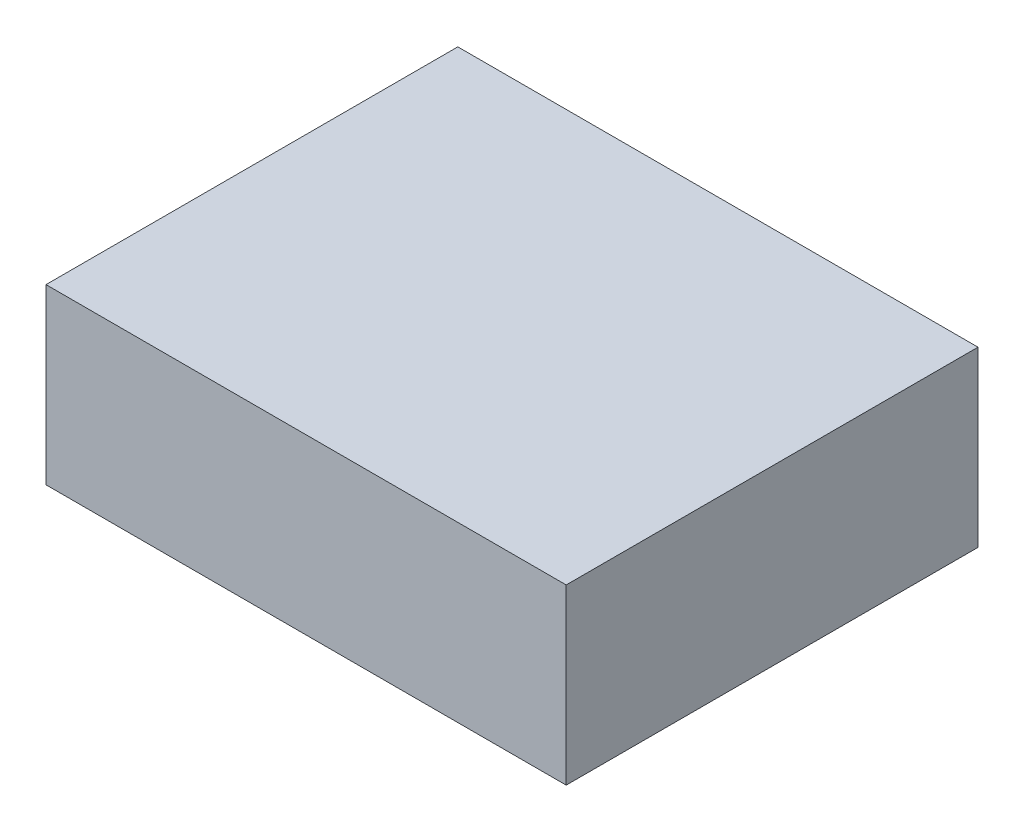
ISO-10303-21;
HEADER;
FILE_DESCRIPTION(('STEP AP214'),'2;1');
FILE_NAME('part.step','',(''),(''),'','','');
FILE_SCHEMA(('AUTOMOTIVE_DESIGN { 1 0 10303 214 1 1 1 1 }'));
ENDSEC;
DATA;
#1=APPLICATION_CONTEXT('core data for automotive mechanical design processes');
#2=APPLICATION_PROTOCOL_DEFINITION('international standard','automotive_design',2000,#1);
#3=PRODUCT_CONTEXT('',#1,'mechanical');
#4=PRODUCT('Part','Part','',(#3));
#5=PRODUCT_RELATED_PRODUCT_CATEGORY('part','',(#4));
#6=PRODUCT_DEFINITION_FORMATION('','',#4);
#7=PRODUCT_DEFINITION_CONTEXT('part definition',#1,'design');
#8=PRODUCT_DEFINITION('design','',#6,#7);
#9=PRODUCT_DEFINITION_SHAPE('','',#8);
#10=(LENGTH_UNIT() NAMED_UNIT(*) SI_UNIT(.MILLI.,.METRE.));
#11=(NAMED_UNIT(*) PLANE_ANGLE_UNIT() SI_UNIT($,.RADIAN.));
#12=(NAMED_UNIT(*) SI_UNIT($,.STERADIAN.) SOLID_ANGLE_UNIT());
#13=UNCERTAINTY_MEASURE_WITH_UNIT(LENGTH_MEASURE(1.E-05),#10,'distance_accuracy_value','');
#14=(GEOMETRIC_REPRESENTATION_CONTEXT(3) GLOBAL_UNCERTAINTY_ASSIGNED_CONTEXT((#13)) GLOBAL_UNIT_ASSIGNED_CONTEXT((#10,
#11,#12)) REPRESENTATION_CONTEXT('',''));
#15=CARTESIAN_POINT('',(0.,0.,0.));
#16=DIRECTION('',(0.,0.,1.));
#17=DIRECTION('',(1.,0.,0.));
#18=AXIS2_PLACEMENT_3D('',#15,#16,#17);
#19=CARTESIAN_POINT('',(-60.,40.,-47.5));
#20=DIRECTION('',(1.,0.,0.));
#21=DIRECTION('',(0.,0.,-1.));
#22=AXIS2_PLACEMENT_3D('',#19,#20,#21);
#23=PLANE('',#22);
#24=DIRECTION('',(0.,0.,1.));
#25=VECTOR('',#24,1.);
#26=CARTESIAN_POINT('',(-60.,0.,-47.5));
#27=LINE('',#26,#25);
#28=CARTESIAN_POINT('',(-60.,0.,-47.5));
#29=VERTEX_POINT('',#28);
#30=CARTESIAN_POINT('',(-60.,0.,47.5));
#31=VERTEX_POINT('',#30);
#32=EDGE_CURVE('E105',#29,#31,#27,.T.);
#33=ORIENTED_EDGE('',*,*,#32,.T.);
#34=DIRECTION('',(0.,-1.,0.));
#35=VECTOR('',#34,1.);
#36=CARTESIAN_POINT('',(-60.,40.,47.5));
#37=LINE('',#36,#35);
#38=CARTESIAN_POINT('',(-60.,40.,47.5));
#39=VERTEX_POINT('',#38);
#40=EDGE_CURVE('E11',#39,#31,#37,.T.);
#41=ORIENTED_EDGE('',*,*,#40,.F.);
#42=DIRECTION('',(0.,0.,1.));
#43=VECTOR('',#42,1.);
#44=CARTESIAN_POINT('',(-60.,40.,-47.5));
#45=LINE('',#44,#43);
#46=CARTESIAN_POINT('',(-60.,40.,-47.5));
#47=VERTEX_POINT('',#46);
#48=EDGE_CURVE('E89',#47,#39,#45,.T.);
#49=ORIENTED_EDGE('',*,*,#48,.F.);
#50=DIRECTION('',(0.,-1.,0.));
#51=VECTOR('',#50,1.);
#52=CARTESIAN_POINT('',(-60.,40.,-47.5));
#53=LINE('',#52,#51);
#54=EDGE_CURVE('E98',#47,#29,#53,.T.);
#55=ORIENTED_EDGE('',*,*,#54,.T.);
#56=EDGE_LOOP('',(#33,#41,#49,#55));
#57=FACE_BOUND('',#56,.T.);
#58=ADVANCED_FACE('F39',(#57),#23,.F.);
#59=CARTESIAN_POINT('',(-60.,40.,47.5));
#60=DIRECTION('',(0.,0.,-1.));
#61=DIRECTION('',(-1.,0.,0.));
#62=AXIS2_PLACEMENT_3D('',#59,#60,#61);
#63=PLANE('',#62);
#64=DIRECTION('',(1.,0.,0.));
#65=VECTOR('',#64,1.);
#66=CARTESIAN_POINT('',(-60.,0.,47.5));
#67=LINE('',#66,#65);
#68=CARTESIAN_POINT('',(60.,0.,47.5));
#69=VERTEX_POINT('',#68);
#70=EDGE_CURVE('E94',#31,#69,#67,.T.);
#71=ORIENTED_EDGE('',*,*,#70,.T.);
#72=DIRECTION('',(0.,-1.,0.));
#73=VECTOR('',#72,1.);
#74=CARTESIAN_POINT('',(60.,40.,47.5));
#75=LINE('',#74,#73);
#76=CARTESIAN_POINT('',(60.,40.,47.5));
#77=VERTEX_POINT('',#76);
#78=EDGE_CURVE('E50',#77,#69,#75,.T.);
#79=ORIENTED_EDGE('',*,*,#78,.F.);
#80=DIRECTION('',(1.,0.,0.));
#81=VECTOR('',#80,1.);
#82=CARTESIAN_POINT('',(-60.,40.,47.5));
#83=LINE('',#82,#81);
#84=EDGE_CURVE('E83',#39,#77,#83,.T.);
#85=ORIENTED_EDGE('',*,*,#84,.F.);
#86=ORIENTED_EDGE('',*,*,#40,.T.);
#87=EDGE_LOOP('',(#71,#79,#85,#86));
#88=FACE_BOUND('',#87,.T.);
#89=ADVANCED_FACE('F91',(#88),#63,.F.);
#90=CARTESIAN_POINT('',(60.,40.,-47.5));
#91=DIRECTION('',(-1.,0.,0.));
#92=DIRECTION('',(0.,0.,1.));
#93=AXIS2_PLACEMENT_3D('',#90,#91,#92);
#94=PLANE('',#93);
#95=DIRECTION('',(0.,0.,-1.));
#96=VECTOR('',#95,1.);
#97=CARTESIAN_POINT('',(60.,0.,-47.5));
#98=LINE('',#97,#96);
#99=CARTESIAN_POINT('',(60.,0.,-47.5));
#100=VERTEX_POINT('',#99);
#101=EDGE_CURVE('E75',#69,#100,#98,.T.);
#102=ORIENTED_EDGE('',*,*,#101,.T.);
#103=DIRECTION('',(0.,-1.,0.));
#104=VECTOR('',#103,1.);
#105=CARTESIAN_POINT('',(60.,40.,-47.5));
#106=LINE('',#105,#104);
#107=CARTESIAN_POINT('',(60.,40.,-47.5));
#108=VERTEX_POINT('',#107);
#109=EDGE_CURVE('E92',#108,#100,#106,.T.);
#110=ORIENTED_EDGE('',*,*,#109,.F.);
#111=DIRECTION('',(0.,0.,-1.));
#112=VECTOR('',#111,1.);
#113=CARTESIAN_POINT('',(60.,40.,-47.5));
#114=LINE('',#113,#112);
#115=EDGE_CURVE('E86',#77,#108,#114,.T.);
#116=ORIENTED_EDGE('',*,*,#115,.F.);
#117=ORIENTED_EDGE('',*,*,#78,.T.);
#118=EDGE_LOOP('',(#102,#110,#116,#117));
#119=FACE_BOUND('',#118,.T.);
#120=ADVANCED_FACE('F96',(#119),#94,.F.);
#121=CARTESIAN_POINT('',(-60.,40.,-47.5));
#122=DIRECTION('',(0.,0.,1.));
#123=DIRECTION('',(1.,0.,0.));
#124=AXIS2_PLACEMENT_3D('',#121,#122,#123);
#125=PLANE('',#124);
#126=DIRECTION('',(-1.,0.,0.));
#127=VECTOR('',#126,1.);
#128=CARTESIAN_POINT('',(-60.,0.,-47.5));
#129=LINE('',#128,#127);
#130=EDGE_CURVE('E79',#100,#29,#129,.T.);
#131=ORIENTED_EDGE('',*,*,#130,.T.);
#132=ORIENTED_EDGE('',*,*,#54,.F.);
#133=DIRECTION('',(-1.,0.,0.));
#134=VECTOR('',#133,1.);
#135=CARTESIAN_POINT('',(-60.,40.,-47.5));
#136=LINE('',#135,#134);
#137=EDGE_CURVE('E54',#108,#47,#136,.T.);
#138=ORIENTED_EDGE('',*,*,#137,.F.);
#139=ORIENTED_EDGE('',*,*,#109,.T.);
#140=EDGE_LOOP('',(#131,#132,#138,#139));
#141=FACE_BOUND('',#140,.T.);
#142=ADVANCED_FACE('F108',(#141),#125,.F.);
#143=CARTESIAN_POINT('',(0.,40.,0.));
#144=DIRECTION('',(0.,1.,0.));
#145=DIRECTION('',(0.,0.,1.));
#146=AXIS2_PLACEMENT_3D('',#143,#144,#145);
#147=PLANE('',#146);
#148=ORIENTED_EDGE('',*,*,#48,.T.);
#149=ORIENTED_EDGE('',*,*,#84,.T.);
#150=ORIENTED_EDGE('',*,*,#115,.T.);
#151=ORIENTED_EDGE('',*,*,#137,.T.);
#152=EDGE_LOOP('',(#148,#149,#150,#151));
#153=FACE_BOUND('',#152,.T.);
#154=ADVANCED_FACE('F88',(#153),#147,.T.);
#155=CARTESIAN_POINT('',(0.,0.,0.));
#156=DIRECTION('',(0.,1.,0.));
#157=DIRECTION('',(0.,0.,1.));
#158=AXIS2_PLACEMENT_3D('',#155,#156,#157);
#159=PLANE('',#158);
#160=ORIENTED_EDGE('',*,*,#32,.F.);
#161=ORIENTED_EDGE('',*,*,#130,.F.);
#162=ORIENTED_EDGE('',*,*,#101,.F.);
#163=ORIENTED_EDGE('',*,*,#70,.F.);
#164=EDGE_LOOP('',(#160,#161,#162,#163));
#165=FACE_BOUND('',#164,.T.);
#166=ADVANCED_FACE('F115',(#165),#159,.F.);
#167=CLOSED_SHELL('',(#58,#89,#120,#142,#154,#166));
#168=MANIFOLD_SOLID_BREP('B2',#167);
#169=ADVANCED_BREP_SHAPE_REPRESENTATION('',(#18,#168),#14);
#170=SHAPE_DEFINITION_REPRESENTATION(#9,#169);
ENDSEC;
END-ISO-10303-21;
